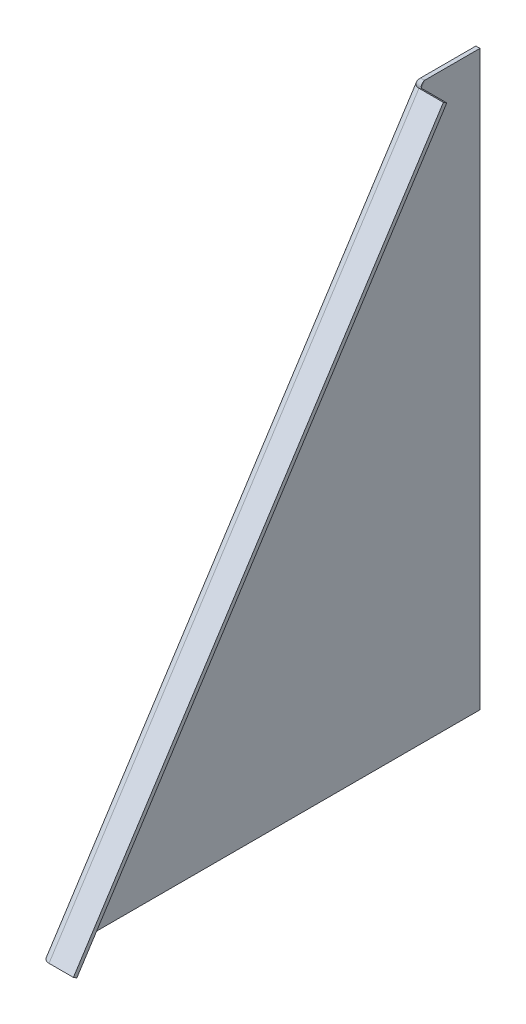
ISO-10303-21;
HEADER;
FILE_DESCRIPTION(('STEP AP214'),'2;1');
FILE_NAME('part.step','',(''),(''),'','','');
FILE_SCHEMA(('AUTOMOTIVE_DESIGN { 1 0 10303 214 1 1 1 1 }'));
ENDSEC;
DATA;
#1=APPLICATION_CONTEXT('core data for automotive mechanical design processes');
#2=APPLICATION_PROTOCOL_DEFINITION('international standard','automotive_design',2000,#1);
#3=PRODUCT_CONTEXT('',#1,'mechanical');
#4=PRODUCT('Part','Part','',(#3));
#5=PRODUCT_RELATED_PRODUCT_CATEGORY('part','',(#4));
#6=PRODUCT_DEFINITION_FORMATION('','',#4);
#7=PRODUCT_DEFINITION_CONTEXT('part definition',#1,'design');
#8=PRODUCT_DEFINITION('design','',#6,#7);
#9=PRODUCT_DEFINITION_SHAPE('','',#8);
#10=(LENGTH_UNIT() NAMED_UNIT(*) SI_UNIT(.MILLI.,.METRE.));
#11=(NAMED_UNIT(*) PLANE_ANGLE_UNIT() SI_UNIT($,.RADIAN.));
#12=(NAMED_UNIT(*) SI_UNIT($,.STERADIAN.) SOLID_ANGLE_UNIT());
#13=UNCERTAINTY_MEASURE_WITH_UNIT(LENGTH_MEASURE(1.E-05),#10,'distance_accuracy_value','');
#14=(GEOMETRIC_REPRESENTATION_CONTEXT(3) GLOBAL_UNCERTAINTY_ASSIGNED_CONTEXT((#13)) GLOBAL_UNIT_ASSIGNED_CONTEXT((#10,
#11,#12)) REPRESENTATION_CONTEXT('',''));
#15=CARTESIAN_POINT('',(0.,0.,0.));
#16=DIRECTION('',(0.,0.,1.));
#17=DIRECTION('',(1.,0.,0.));
#18=AXIS2_PLACEMENT_3D('',#15,#16,#17);
#19=CARTESIAN_POINT('',(0.,523.452885996143,-2.28798994621813E-12));
#20=DIRECTION('',(0.,-1.,0.));
#21=DIRECTION('',(0.,0.,-1.));
#22=AXIS2_PLACEMENT_3D('',#19,#20,#21);
#23=PLANE('',#22);
#24=DIRECTION('',(-1.,0.,0.));
#25=VECTOR('',#24,1.);
#26=CARTESIAN_POINT('',(0.,523.452885996142,-198.05916944854));
#27=LINE('',#26,#25);
#28=CARTESIAN_POINT('',(3.175,523.452885996142,-198.05916944854));
#29=VERTEX_POINT('',#28);
#30=CARTESIAN_POINT('',(0.,523.452885996142,-198.05916944854));
#31=VERTEX_POINT('',#30);
#32=EDGE_CURVE('E11',#29,#31,#27,.T.);
#33=ORIENTED_EDGE('',*,*,#32,.F.);
#34=DIRECTION('',(0.,0.,-1.));
#35=VECTOR('',#34,1.);
#36=CARTESIAN_POINT('',(3.175,523.452885996142,0.));
#37=LINE('',#36,#35);
#38=CARTESIAN_POINT('',(3.175,523.452885996142,-241.3));
#39=VERTEX_POINT('',#38);
#40=EDGE_CURVE('E90',#29,#39,#37,.T.);
#41=ORIENTED_EDGE('',*,*,#40,.T.);
#42=DIRECTION('',(-1.,0.,0.));
#43=VECTOR('',#42,1.);
#44=CARTESIAN_POINT('',(0.,523.452885996142,-241.3));
#45=LINE('',#44,#43);
#46=CARTESIAN_POINT('',(0.,523.452885996142,-241.3));
#47=VERTEX_POINT('',#46);
#48=EDGE_CURVE('E51',#39,#47,#45,.T.);
#49=ORIENTED_EDGE('',*,*,#48,.T.);
#50=DIRECTION('',(0.,0.,-1.));
#51=VECTOR('',#50,1.);
#52=CARTESIAN_POINT('',(0.,523.452885996143,-2.28798994621813E-12));
#53=LINE('',#52,#51);
#54=EDGE_CURVE('E93',#31,#47,#53,.T.);
#55=ORIENTED_EDGE('',*,*,#54,.F.);
#56=EDGE_LOOP('',(#33,#41,#49,#55));
#57=FACE_BOUND('',#56,.T.);
#58=ADVANCED_FACE('F39',(#57),#23,.F.);
#59=CARTESIAN_POINT('',(0.,0.,-241.3));
#60=DIRECTION('',(0.,0.,1.));
#61=DIRECTION('',(0.,-1.,0.));
#62=AXIS2_PLACEMENT_3D('',#59,#60,#61);
#63=PLANE('',#62);
#64=ORIENTED_EDGE('',*,*,#48,.F.);
#65=DIRECTION('',(0.,1.,0.));
#66=VECTOR('',#65,1.);
#67=CARTESIAN_POINT('',(3.175,0.,-241.3));
#68=LINE('',#67,#66);
#69=CARTESIAN_POINT('',(3.175,76.2,-241.3));
#70=VERTEX_POINT('',#69);
#71=EDGE_CURVE('E117',#39,#70,#68,.F.);
#72=ORIENTED_EDGE('',*,*,#71,.T.);
#73=DIRECTION('',(-1.,0.,0.));
#74=VECTOR('',#73,1.);
#75=CARTESIAN_POINT('',(0.,76.2,-241.3));
#76=LINE('',#75,#74);
#77=CARTESIAN_POINT('',(0.,76.2,-241.3));
#78=VERTEX_POINT('',#77);
#79=EDGE_CURVE('E135',#70,#78,#76,.T.);
#80=ORIENTED_EDGE('',*,*,#79,.T.);
#81=DIRECTION('',(0.,-1.,0.));
#82=VECTOR('',#81,1.);
#83=CARTESIAN_POINT('',(0.,0.,-241.3));
#84=LINE('',#83,#82);
#85=EDGE_CURVE('E147',#47,#78,#84,.T.);
#86=ORIENTED_EDGE('',*,*,#85,.F.);
#87=EDGE_LOOP('',(#64,#72,#80,#86));
#88=FACE_BOUND('',#87,.T.);
#89=ADVANCED_FACE('F153',(#88),#63,.F.);
#90=CARTESIAN_POINT('',(0.,76.2,0.));
#91=DIRECTION('',(0.,-1.,0.));
#92=DIRECTION('',(0.,0.,-1.));
#93=AXIS2_PLACEMENT_3D('',#90,#91,#92);
#94=PLANE('',#93);
#95=ORIENTED_EDGE('',*,*,#79,.F.);
#96=DIRECTION('',(0.,0.,-1.));
#97=VECTOR('',#96,1.);
#98=CARTESIAN_POINT('',(3.175,76.2,0.));
#99=LINE('',#98,#97);
#100=CARTESIAN_POINT('',(3.175,76.2,90.7916527573016));
#101=VERTEX_POINT('',#100);
#102=EDGE_CURVE('E182',#101,#70,#99,.T.);
#103=ORIENTED_EDGE('',*,*,#102,.F.);
#104=DIRECTION('',(-1.,0.,0.));
#105=VECTOR('',#104,1.);
#106=CARTESIAN_POINT('',(0.,76.2,90.7916527573016));
#107=LINE('',#106,#105);
#108=CARTESIAN_POINT('',(0.,76.2,90.7916527573016));
#109=VERTEX_POINT('',#108);
#110=EDGE_CURVE('E132',#101,#109,#107,.T.);
#111=ORIENTED_EDGE('',*,*,#110,.T.);
#112=DIRECTION('',(0.,0.,-1.));
#113=VECTOR('',#112,1.);
#114=CARTESIAN_POINT('',(0.,76.2,0.));
#115=LINE('',#114,#113);
#116=EDGE_CURVE('E154',#109,#78,#115,.T.);
#117=ORIENTED_EDGE('',*,*,#116,.T.);
#118=EDGE_LOOP('',(#95,#103,#111,#117));
#119=FACE_BOUND('',#118,.T.);
#120=ADVANCED_FACE('F185',(#119),#94,.T.);
#121=CARTESIAN_POINT('',(6.35,76.2,98.3508222058413));
#122=CARTESIAN_POINT('',(6.35,75.6258272516882,97.461780531036));
#123=CARTESIAN_POINT('',(6.35,75.0516545033765,96.5727388562307));
#124=CARTESIAN_POINT('',(6.35,74.4774817550647,95.6836971814255));
#125=CARTESIAN_POINT('',(19.05,76.2,98.3508222058413));
#126=CARTESIAN_POINT('',(16.9333333333333,75.6258272516882,97.461780531036));
#127=CARTESIAN_POINT('',(14.8166666666667,75.0516545033765,96.5727388562308));
#128=CARTESIAN_POINT('',(12.7,74.4774817550647,95.6836971814255));
#129=CARTESIAN_POINT('',(19.05,76.2,83.2324833087619));
#130=CARTESIAN_POINT('',(16.9333333333333,76.7741727483117,84.1215249835672));
#131=CARTESIAN_POINT('',(14.8166666666667,77.3483454966235,85.0105666583725));
#132=CARTESIAN_POINT('',(12.7,77.9225182449352,85.8996083331777));
#133=CARTESIAN_POINT('',(6.35,76.2,83.2324833087619));
#134=CARTESIAN_POINT('',(6.35,76.7741727483117,84.1215249835672));
#135=CARTESIAN_POINT('',(6.35,77.3483454966235,85.0105666583725));
#136=CARTESIAN_POINT('',(6.35,77.9225182449352,85.8996083331777));
#137=CARTESIAN_POINT('',(-6.35,76.2,83.2324833087619));
#138=CARTESIAN_POINT('',(-4.23333333333333,76.7741727483117,84.1215249835672));
#139=CARTESIAN_POINT('',(-2.11666666666667,77.3483454966235,85.0105666583725));
#140=CARTESIAN_POINT('',(0.,77.9225182449352,85.8996083331777));
#141=CARTESIAN_POINT('',(-6.35,76.2,98.3508222058413));
#142=CARTESIAN_POINT('',(-4.23333333333333,75.6258272516882,97.461780531036));
#143=CARTESIAN_POINT('',(-2.11666666666667,75.0516545033765,96.5727388562308));
#144=CARTESIAN_POINT('',(0.,74.4774817550647,95.6836971814255));
#145=CARTESIAN_POINT('',(6.35,76.2,98.3508222058413));
#146=CARTESIAN_POINT('',(6.35,75.6258272516882,97.461780531036));
#147=CARTESIAN_POINT('',(6.35,75.0516545033765,96.5727388562307));
#148=CARTESIAN_POINT('',(6.35,74.4774817550647,95.6836971814255));
#149=(BOUNDED_SURFACE() B_SPLINE_SURFACE(3,3,((#121,#122,#123,#124),(#125,#126,#127,#128),(#129,
#130,#131,#132),(#133,#134,#135,#136),(#137,#138,#139,#140),(#141,#142,#143,#144),(#145,#146,
#147,#148)),.UNSPECIFIED.,.T.,.F.,.F.) B_SPLINE_SURFACE_WITH_KNOTS((4,3,4),(4,4),(0.,0.5,1.),
(0.,1.),.UNSPECIFIED.) GEOMETRIC_REPRESENTATION_ITEM() RATIONAL_B_SPLINE_SURFACE(((1.,1.,1.,1.),
(0.333333333333333,0.333333333333333,0.333333333333333,0.333333333333333),(0.333333333333333,
0.333333333333333,0.333333333333333,0.333333333333333),(1.,1.,1.,1.),(0.333333333333333,
0.333333333333333,0.333333333333333,0.333333333333333),(0.333333333333333,0.333333333333333,
0.333333333333333,0.333333333333333),(1.,1.,1.,1.))) REPRESENTATION_ITEM('') SURFACE());
#150=CARTESIAN_POINT('',(6.35,76.2,90.7916527573016));
#151=DIRECTION('',(0.,-0.943237308778507,-0.332119525665504));
#152=DIRECTION('',(0.,-0.332119525665504,0.943237308778507));
#153=AXIS2_PLACEMENT_3D('',#150,#151,#152);
#154=ELLIPSE('',#153,5.18644075949356,3.175);
#155=CARTESIAN_POINT('',(6.35,74.4774817550647,95.6836971814255));
#156=VERTEX_POINT('',#155);
#157=EDGE_CURVE('E107',#101,#156,#154,.F.);
#158=DIRECTION('',(0.,0.542525431475664,0.840039377768771));
#159=VECTOR('',#158,1.);
#160=CARTESIAN_POINT('',(6.35,76.2,98.3508222058413));
#161=LINE('',#160,#159);
#162=CARTESIAN_POINT('',(6.35,76.2,98.3508222058413));
#163=VERTEX_POINT('',#162);
#164=EDGE_CURVE('E130',#156,#163,#161,.T.);
#165=CARTESIAN_POINT('',(6.35,76.2,90.7916527573016));
#166=DIRECTION('',(0.,-1.,0.));
#167=DIRECTION('',(0.,0.,1.));
#168=AXIS2_PLACEMENT_3D('',#165,#166,#167);
#169=ELLIPSE('',#168,7.55916944853971,6.35);
#170=EDGE_CURVE('E151',#109,#163,#169,.F.);
#171=ORIENTED_EDGE('',*,*,#110,.F.);
#172=ORIENTED_EDGE('',*,*,#157,.T.);
#173=ORIENTED_EDGE('',*,*,#164,.T.);
#174=ORIENTED_EDGE('',*,*,#170,.F.);
#175=EDGE_LOOP('',(#171,#172,#173,#174));
#176=FACE_BOUND('',#175,.T.);
#177=ADVANCED_FACE('F190',(#176),#149,.F.);
#178=CARTESIAN_POINT('',(25.4,76.2,98.3508222058413));
#179=DIRECTION('',(0.,0.840039377768771,-0.542525431475664));
#180=DIRECTION('',(-1.,0.,0.));
#181=AXIS2_PLACEMENT_3D('',#178,#179,#180);
#182=PLANE('',#181);
#183=ORIENTED_EDGE('',*,*,#164,.F.);
#184=DIRECTION('',(1.,0.,0.));
#185=VECTOR('',#184,1.);
#186=CARTESIAN_POINT('',(25.4,74.4774817550647,95.6836971814254));
#187=LINE('',#186,#185);
#188=CARTESIAN_POINT('',(25.4,74.4774817550647,95.6836971814254));
#189=VERTEX_POINT('',#188);
#190=EDGE_CURVE('E180',#189,#156,#187,.F.);
#191=ORIENTED_EDGE('',*,*,#190,.F.);
#192=DIRECTION('',(0.,0.542525431475664,0.840039377768771));
#193=VECTOR('',#192,1.);
#194=CARTESIAN_POINT('',(25.4,76.2,98.3508222058413));
#195=LINE('',#194,#193);
#196=CARTESIAN_POINT('',(25.4,76.2,98.3508222058413));
#197=VERTEX_POINT('',#196);
#198=EDGE_CURVE('E127',#189,#197,#195,.T.);
#199=ORIENTED_EDGE('',*,*,#198,.T.);
#200=DIRECTION('',(-1.,0.,0.));
#201=VECTOR('',#200,1.);
#202=CARTESIAN_POINT('',(25.4,76.2,98.3508222058413));
#203=LINE('',#202,#201);
#204=EDGE_CURVE('E156',#197,#163,#203,.T.);
#205=ORIENTED_EDGE('',*,*,#204,.T.);
#206=EDGE_LOOP('',(#183,#191,#199,#205));
#207=FACE_BOUND('',#206,.T.);
#208=ADVANCED_FACE('F206',(#207),#182,.F.);
#209=CARTESIAN_POINT('',(25.4,67.2509107020801,104.130442377415));
#210=DIRECTION('',(1.,0.,0.));
#211=DIRECTION('',(0.,0.840039377768771,-0.542525431475664));
#212=AXIS2_PLACEMENT_3D('',#209,#210,#211);
#213=PLANE('',#212);
#214=ORIENTED_EDGE('',*,*,#198,.F.);
#215=DIRECTION('',(0.,-0.840039377768771,0.542525431475664));
#216=VECTOR('',#215,1.);
#217=CARTESIAN_POINT('',(25.4,65.5283924571449,101.463317352999));
#218=LINE('',#217,#216);
#219=CARTESIAN_POINT('',(25.4,521.730367751206,-193.167125024416));
#220=VERTEX_POINT('',#219);
#221=EDGE_CURVE('E177',#189,#220,#218,.F.);
#222=ORIENTED_EDGE('',*,*,#221,.T.);
#223=DIRECTION('',(0.,0.542525431475664,0.840039377768771));
#224=VECTOR('',#223,1.);
#225=CARTESIAN_POINT('',(25.4,523.452885996142,-190.5));
#226=LINE('',#225,#224);
#227=CARTESIAN_POINT('',(25.4,523.452885996142,-190.5));
#228=VERTEX_POINT('',#227);
#229=EDGE_CURVE('E124',#220,#228,#226,.T.);
#230=ORIENTED_EDGE('',*,*,#229,.T.);
#231=DIRECTION('',(0.,0.840039377768771,-0.542525431475664));
#232=VECTOR('',#231,1.);
#233=CARTESIAN_POINT('',(25.4,67.2509107020801,104.130442377415));
#234=LINE('',#233,#232);
#235=EDGE_CURVE('E161',#197,#228,#234,.T.);
#236=ORIENTED_EDGE('',*,*,#235,.F.);
#237=EDGE_LOOP('',(#214,#222,#230,#236));
#238=FACE_BOUND('',#237,.T.);
#239=ADVANCED_FACE('F208',(#238),#213,.T.);
#240=CARTESIAN_POINT('',(25.4,523.452885996142,-190.5));
#241=DIRECTION('',(0.,0.840039377768771,-0.542525431475664));
#242=DIRECTION('',(-1.,0.,0.));
#243=AXIS2_PLACEMENT_3D('',#240,#241,#242);
#244=PLANE('',#243);
#245=ORIENTED_EDGE('',*,*,#229,.F.);
#246=DIRECTION('',(1.,0.,0.));
#247=VECTOR('',#246,1.);
#248=CARTESIAN_POINT('',(25.4,521.730367751206,-193.167125024416));
#249=LINE('',#248,#247);
#250=CARTESIAN_POINT('',(6.35,521.730367751206,-193.167125024416));
#251=VERTEX_POINT('',#250);
#252=EDGE_CURVE('E112',#220,#251,#249,.F.);
#253=ORIENTED_EDGE('',*,*,#252,.T.);
#254=DIRECTION('',(0.,0.542525431475666,0.84003937776877));
#255=VECTOR('',#254,1.);
#256=CARTESIAN_POINT('',(6.35,523.452885996142,-190.5));
#257=LINE('',#256,#255);
#258=CARTESIAN_POINT('',(6.35,523.452885996142,-190.5));
#259=VERTEX_POINT('',#258);
#260=EDGE_CURVE('E45',#251,#259,#257,.T.);
#261=ORIENTED_EDGE('',*,*,#260,.T.);
#262=DIRECTION('',(-1.,0.,0.));
#263=VECTOR('',#262,1.);
#264=CARTESIAN_POINT('',(25.4,523.452885996142,-190.5));
#265=LINE('',#264,#263);
#266=EDGE_CURVE('E164',#228,#259,#265,.T.);
#267=ORIENTED_EDGE('',*,*,#266,.F.);
#268=EDGE_LOOP('',(#245,#253,#261,#267));
#269=FACE_BOUND('',#268,.T.);
#270=ADVANCED_FACE('F200',(#269),#244,.T.);
#271=CARTESIAN_POINT('',(6.35,523.452885996142,-190.5));
#272=CARTESIAN_POINT('',(6.35,522.87871324783,-191.389041674805));
#273=CARTESIAN_POINT('',(6.35,522.304540499518,-192.278083349611));
#274=CARTESIAN_POINT('',(6.35,521.730367751207,-193.167125024416));
#275=CARTESIAN_POINT('',(-6.35,523.452885996142,-190.5));
#276=CARTESIAN_POINT('',(-4.23333333333333,522.87871324783,-191.389041674805));
#277=CARTESIAN_POINT('',(-2.11666666666667,522.304540499518,-192.278083349611));
#278=CARTESIAN_POINT('',(0.,521.730367751207,-193.167125024416));
#279=CARTESIAN_POINT('',(-6.35,523.452885996142,-205.618338897079));
#280=CARTESIAN_POINT('',(-4.23333333333333,524.027058744454,-204.729297222274));
#281=CARTESIAN_POINT('',(-2.11666666666667,524.601231492765,-203.840255547469));
#282=CARTESIAN_POINT('',(0.,525.175404241077,-202.951213872664));
#283=CARTESIAN_POINT('',(6.35,523.452885996142,-205.618338897079));
#284=CARTESIAN_POINT('',(6.35,524.027058744454,-204.729297222274));
#285=CARTESIAN_POINT('',(6.35,524.601231492765,-203.840255547469));
#286=CARTESIAN_POINT('',(6.35,525.175404241077,-202.951213872664));
#287=CARTESIAN_POINT('',(19.05,523.452885996142,-205.618338897079));
#288=CARTESIAN_POINT('',(16.9333333333333,524.027058744454,-204.729297222274));
#289=CARTESIAN_POINT('',(14.8166666666667,524.601231492765,-203.840255547469));
#290=CARTESIAN_POINT('',(12.7,525.175404241077,-202.951213872664));
#291=CARTESIAN_POINT('',(19.05,523.452885996142,-190.5));
#292=CARTESIAN_POINT('',(16.9333333333333,522.87871324783,-191.389041674805));
#293=CARTESIAN_POINT('',(14.8166666666667,522.304540499518,-192.278083349611));
#294=CARTESIAN_POINT('',(12.7,521.730367751207,-193.167125024416));
#295=CARTESIAN_POINT('',(6.35,523.452885996142,-190.5));
#296=CARTESIAN_POINT('',(6.35,522.87871324783,-191.389041674805));
#297=CARTESIAN_POINT('',(6.35,522.304540499518,-192.278083349611));
#298=CARTESIAN_POINT('',(6.35,521.730367751207,-193.167125024416));
#299=(BOUNDED_SURFACE() B_SPLINE_SURFACE(3,3,((#271,#272,#273,#274),(#275,#276,#277,#278),(#279,
#280,#281,#282),(#283,#284,#285,#286),(#287,#288,#289,#290),(#291,#292,#293,#294),(#295,#296,
#297,#298)),.UNSPECIFIED.,.T.,.F.,.F.) B_SPLINE_SURFACE_WITH_KNOTS((4,3,4),(4,4),(0.,0.5,1.),
(0.,1.),.UNSPECIFIED.) GEOMETRIC_REPRESENTATION_ITEM() RATIONAL_B_SPLINE_SURFACE(((1.,1.,1.,1.),
(0.333333333333333,0.333333333333333,0.333333333333333,0.333333333333333),(0.333333333333333,
0.333333333333333,0.333333333333333,0.333333333333333),(1.,1.,1.,1.),(0.333333333333333,
0.333333333333333,0.333333333333333,0.333333333333333),(0.333333333333333,0.333333333333333,
0.333333333333333,0.333333333333333),(1.,1.,1.,1.))) REPRESENTATION_ITEM('') SURFACE());
#300=CARTESIAN_POINT('',(6.35,523.452885996142,-198.05916944854));
#301=DIRECTION('',(0.,0.943237308778506,0.332119525665506));
#302=DIRECTION('',(0.,-0.332119525665506,0.943237308778506));
#303=AXIS2_PLACEMENT_3D('',#300,#301,#302);
#304=ELLIPSE('',#303,5.18644075949355,3.175);
#305=EDGE_CURVE('E105',#251,#29,#304,.F.);
#306=CARTESIAN_POINT('',(6.35,523.452885996142,-198.05916944854));
#307=DIRECTION('',(0.,1.,0.));
#308=DIRECTION('',(0.,0.,1.));
#309=AXIS2_PLACEMENT_3D('',#306,#307,#308);
#310=ELLIPSE('',#309,7.55916944853968,6.35);
#311=EDGE_CURVE('E171',#259,#31,#310,.F.);
#312=ORIENTED_EDGE('',*,*,#305,.T.);
#313=ORIENTED_EDGE('',*,*,#32,.T.);
#314=ORIENTED_EDGE('',*,*,#311,.F.);
#315=ORIENTED_EDGE('',*,*,#260,.F.);
#316=EDGE_LOOP('',(#312,#313,#314,#315));
#317=FACE_BOUND('',#316,.T.);
#318=ADVANCED_FACE('F41',(#317),#299,.F.);
#319=CARTESIAN_POINT('',(25.4,67.2509107020801,104.130442377415));
#320=DIRECTION('',(0.,0.542525431475664,0.840039377768771));
#321=DIRECTION('',(0.,-0.840039377768771,0.542525431475664));
#322=AXIS2_PLACEMENT_3D('',#319,#320,#321);
#323=PLANE('',#322);
#324=ORIENTED_EDGE('',*,*,#266,.T.);
#325=DIRECTION('',(0.,0.840039377768771,-0.542525431475664));
#326=VECTOR('',#325,1.);
#327=CARTESIAN_POINT('',(6.35,76.2,98.3508222058413));
#328=LINE('',#327,#326);
#329=EDGE_CURVE('E168',#259,#163,#328,.F.);
#330=ORIENTED_EDGE('',*,*,#329,.T.);
#331=ORIENTED_EDGE('',*,*,#204,.F.);
#332=ORIENTED_EDGE('',*,*,#235,.T.);
#333=EDGE_LOOP('',(#324,#330,#331,#332));
#334=FACE_BOUND('',#333,.T.);
#335=ADVANCED_FACE('F197',(#334),#323,.T.);
#336=CARTESIAN_POINT('',(0.,0.,0.));
#337=DIRECTION('',(1.,0.,0.));
#338=DIRECTION('',(0.,0.,-1.));
#339=AXIS2_PLACEMENT_3D('',#336,#337,#338);
#340=PLANE('',#339);
#341=ORIENTED_EDGE('',*,*,#116,.F.);
#342=DIRECTION('',(0.,0.840039377768771,-0.542525431475664));
#343=VECTOR('',#342,1.);
#344=CARTESIAN_POINT('',(0.,520.007849506271,-195.834250048832));
#345=LINE('',#344,#343);
#346=EDGE_CURVE('E150',#109,#31,#345,.T.);
#347=ORIENTED_EDGE('',*,*,#346,.T.);
#348=ORIENTED_EDGE('',*,*,#54,.T.);
#349=ORIENTED_EDGE('',*,*,#85,.T.);
#350=EDGE_LOOP('',(#341,#347,#348,#349));
#351=FACE_BOUND('',#350,.T.);
#352=ADVANCED_FACE('F146',(#351),#340,.F.);
#353=CARTESIAN_POINT('',(6.35,63.8058742122097,98.7961923285828));
#354=DIRECTION('',(0.,-0.840039377768771,0.542525431475664));
#355=DIRECTION('',(0.,-0.542525431475664,-0.840039377768771));
#356=AXIS2_PLACEMENT_3D('',#353,#354,#355);
#357=CYLINDRICAL_SURFACE('',#356,6.35);
#358=ORIENTED_EDGE('',*,*,#170,.T.);
#359=ORIENTED_EDGE('',*,*,#329,.F.);
#360=ORIENTED_EDGE('',*,*,#311,.T.);
#361=ORIENTED_EDGE('',*,*,#346,.F.);
#362=EDGE_LOOP('',(#358,#359,#360,#361));
#363=FACE_BOUND('',#362,.T.);
#364=ADVANCED_FACE('F193',(#363),#357,.T.);
#365=CARTESIAN_POINT('',(25.4,65.5283924571449,101.463317352999));
#366=DIRECTION('',(0.,0.542525431475664,0.840039377768771));
#367=DIRECTION('',(0.,-0.840039377768771,0.542525431475664));
#368=AXIS2_PLACEMENT_3D('',#365,#366,#367);
#369=PLANE('',#368);
#370=ORIENTED_EDGE('',*,*,#252,.F.);
#371=ORIENTED_EDGE('',*,*,#221,.F.);
#372=ORIENTED_EDGE('',*,*,#190,.T.);
#373=DIRECTION('',(0.,-0.840039377768771,0.542525431475664));
#374=VECTOR('',#373,1.);
#375=CARTESIAN_POINT('',(6.35,65.5283924571449,101.463317352999));
#376=LINE('',#375,#374);
#377=EDGE_CURVE('E111',#251,#156,#376,.T.);
#378=ORIENTED_EDGE('',*,*,#377,.F.);
#379=EDGE_LOOP('',(#370,#371,#372,#378));
#380=FACE_BOUND('',#379,.T.);
#381=ADVANCED_FACE('F289',(#380),#369,.F.);
#382=CARTESIAN_POINT('',(3.175,0.,0.));
#383=DIRECTION('',(1.,0.,0.));
#384=DIRECTION('',(0.,0.,-1.));
#385=AXIS2_PLACEMENT_3D('',#382,#383,#384);
#386=PLANE('',#385);
#387=ORIENTED_EDGE('',*,*,#102,.T.);
#388=ORIENTED_EDGE('',*,*,#71,.F.);
#389=ORIENTED_EDGE('',*,*,#40,.F.);
#390=DIRECTION('',(0.,-0.840039377768771,0.542525431475664));
#391=VECTOR('',#390,1.);
#392=CARTESIAN_POINT('',(3.175,63.8058742122097,98.7961923285828));
#393=LINE('',#392,#391);
#394=EDGE_CURVE('E102',#101,#29,#393,.F.);
#395=ORIENTED_EDGE('',*,*,#394,.F.);
#396=EDGE_LOOP('',(#387,#388,#389,#395));
#397=FACE_BOUND('',#396,.T.);
#398=ADVANCED_FACE('F115',(#397),#386,.T.);
#399=CARTESIAN_POINT('',(6.35,63.8058742122097,98.7961923285828));
#400=DIRECTION('',(0.,-0.840039377768771,0.542525431475664));
#401=DIRECTION('',(0.,-0.542525431475664,-0.840039377768771));
#402=AXIS2_PLACEMENT_3D('',#399,#400,#401);
#403=CYLINDRICAL_SURFACE('',#402,3.175);
#404=ORIENTED_EDGE('',*,*,#157,.F.);
#405=ORIENTED_EDGE('',*,*,#394,.T.);
#406=ORIENTED_EDGE('',*,*,#305,.F.);
#407=ORIENTED_EDGE('',*,*,#377,.T.);
#408=EDGE_LOOP('',(#404,#405,#406,#407));
#409=FACE_BOUND('',#408,.T.);
#410=ADVANCED_FACE('F103',(#409),#403,.F.);
#411=CLOSED_SHELL('',(#58,#89,#120,#177,#208,#239,#270,#318,#335,#352,#364,#381,#398,#410));
#412=MANIFOLD_SOLID_BREP('B2',#411);
#413=ADVANCED_BREP_SHAPE_REPRESENTATION('',(#18,#412),#14);
#414=SHAPE_DEFINITION_REPRESENTATION(#9,#413);
ENDSEC;
END-ISO-10303-21;
